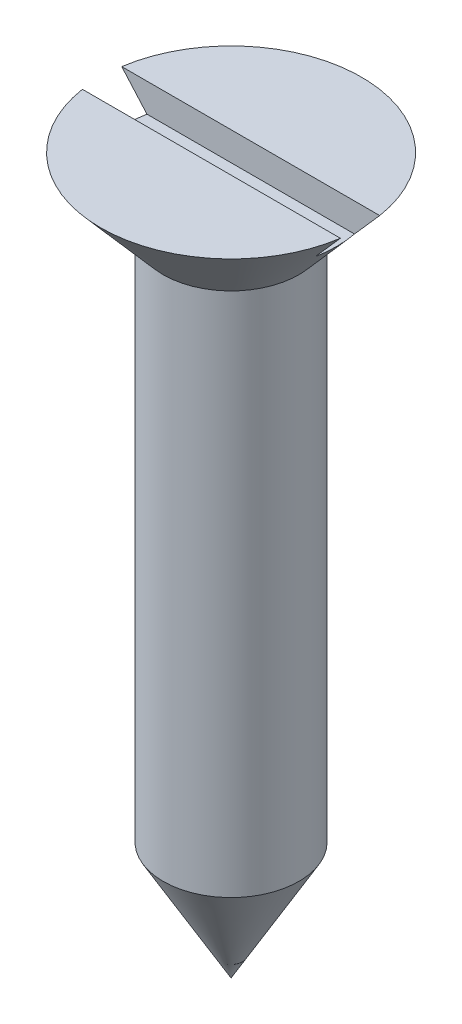
ISO-10303-21;
HEADER;
FILE_DESCRIPTION(('STEP AP214'),'2;1');
FILE_NAME('part.step','',(''),(''),'','','');
FILE_SCHEMA(('AUTOMOTIVE_DESIGN { 1 0 10303 214 1 1 1 1 }'));
ENDSEC;
DATA;
#1=APPLICATION_CONTEXT('core data for automotive mechanical design processes');
#2=APPLICATION_PROTOCOL_DEFINITION('international standard','automotive_design',2000,#1);
#3=PRODUCT_CONTEXT('',#1,'mechanical');
#4=PRODUCT('Part','Part','',(#3));
#5=PRODUCT_RELATED_PRODUCT_CATEGORY('part','',(#4));
#6=PRODUCT_DEFINITION_FORMATION('','',#4);
#7=PRODUCT_DEFINITION_CONTEXT('part definition',#1,'design');
#8=PRODUCT_DEFINITION('design','',#6,#7);
#9=PRODUCT_DEFINITION_SHAPE('','',#8);
#10=(LENGTH_UNIT() NAMED_UNIT(*) SI_UNIT(.MILLI.,.METRE.));
#11=(NAMED_UNIT(*) PLANE_ANGLE_UNIT() SI_UNIT($,.RADIAN.));
#12=(NAMED_UNIT(*) SI_UNIT($,.STERADIAN.) SOLID_ANGLE_UNIT());
#13=UNCERTAINTY_MEASURE_WITH_UNIT(LENGTH_MEASURE(1.E-05),#10,'distance_accuracy_value','');
#14=(GEOMETRIC_REPRESENTATION_CONTEXT(3) GLOBAL_UNCERTAINTY_ASSIGNED_CONTEXT((#13)) GLOBAL_UNIT_ASSIGNED_CONTEXT((#10,
#11,#12)) REPRESENTATION_CONTEXT('',''));
#15=CARTESIAN_POINT('',(0.,0.,0.));
#16=DIRECTION('',(0.,0.,1.));
#17=DIRECTION('',(1.,0.,0.));
#18=AXIS2_PLACEMENT_3D('',#15,#16,#17);
#19=CARTESIAN_POINT('',(0.,25.4,0.));
#20=DIRECTION('',(0.,1.,0.));
#21=DIRECTION('',(0.,0.,1.));
#22=AXIS2_PLACEMENT_3D('',#19,#20,#21);
#23=PLANE('',#22);
#24=DIRECTION('',(1.,0.,0.));
#25=VECTOR('',#24,1.);
#26=CARTESIAN_POINT('',(0.,25.4,0.6985));
#27=LINE('',#26,#25);
#28=CARTESIAN_POINT('',(-4.58257111237786,25.4,0.6985));
#29=VERTEX_POINT('',#28);
#30=CARTESIAN_POINT('',(4.58257111237785,25.4,0.6985));
#31=VERTEX_POINT('',#30);
#32=EDGE_CURVE('E79',#29,#31,#27,.T.);
#33=ORIENTED_EDGE('',*,*,#32,.F.);
#34=CARTESIAN_POINT('',(0.,25.4,0.));
#35=DIRECTION('',(0.,1.,0.));
#36=DIRECTION('',(0.,0.,1.));
#37=AXIS2_PLACEMENT_3D('',#34,#35,#36);
#38=CIRCLE('',#37,4.6355);
#39=EDGE_CURVE('E92',#29,#31,#38,.T.);
#40=ORIENTED_EDGE('',*,*,#39,.T.);
#41=EDGE_LOOP('',(#33,#40));
#42=FACE_BOUND('',#41,.T.);
#43=ADVANCED_FACE('F33',(#42),#23,.T.);
#44=CARTESIAN_POINT('',(0.,25.4,0.));
#45=DIRECTION('',(0.,-1.,0.));
#46=DIRECTION('',(0.,0.,-1.));
#47=AXIS2_PLACEMENT_3D('',#44,#45,#46);
#48=CYLINDRICAL_SURFACE('',#47,2.413);
#49=CARTESIAN_POINT('',(0.,22.8433062149513,0.));
#50=DIRECTION('',(0.,1.,0.));
#51=DIRECTION('',(0.,0.,1.));
#52=AXIS2_PLACEMENT_3D('',#49,#50,#51);
#53=CIRCLE('',#52,2.413);
#54=CARTESIAN_POINT('',(0.,22.8433062149513,2.413));
#55=VERTEX_POINT('',#54);
#56=EDGE_CURVE('E80',#55,#55,#53,.T.);
#57=ORIENTED_EDGE('',*,*,#56,.F.);
#58=EDGE_LOOP('',(#57));
#59=FACE_BOUND('',#58,.T.);
#60=CARTESIAN_POINT('',(0.,4.17943859866376,0.));
#61=DIRECTION('',(0.,1.,0.));
#62=DIRECTION('',(0.,0.,1.));
#63=AXIS2_PLACEMENT_3D('',#60,#61,#62);
#64=CIRCLE('',#63,2.413);
#65=CARTESIAN_POINT('',(0.,4.17943859866376,2.413));
#66=VERTEX_POINT('',#65);
#67=EDGE_CURVE('E97',#66,#66,#64,.T.);
#68=ORIENTED_EDGE('',*,*,#67,.T.);
#69=EDGE_LOOP('',(#68));
#70=FACE_BOUND('',#69,.T.);
#71=ADVANCED_FACE('F35',(#59,#70),#48,.T.);
#72=CARTESIAN_POINT('',(0.,20.0674672483269,0.));
#73=DIRECTION('',(0.,1.,0.));
#74=DIRECTION('',(0.,0.,1.));
#75=AXIS2_PLACEMENT_3D('',#72,#73,#74);
#76=CONICAL_SURFACE('',#75,0.,0.715584993317669);
#77=CARTESIAN_POINT('',(0.,24.384,0.));
#78=DIRECTION('',(0.,1.,0.));
#79=DIRECTION('',(0.,0.,1.));
#80=AXIS2_PLACEMENT_3D('',#77,#78,#79);
#81=CIRCLE('',#80,3.75230467437873);
#82=CARTESIAN_POINT('',(3.68671779763036,24.384,0.6985));
#83=VERTEX_POINT('',#82);
#84=CARTESIAN_POINT('',(3.68671779763036,24.384,-0.6985));
#85=VERTEX_POINT('',#84);
#86=EDGE_CURVE('E11',#83,#85,#81,.T.);
#87=ORIENTED_EDGE('',*,*,#86,.F.);
#88=CARTESIAN_POINT('',(0.66948819119272,21.180484612552,0.6985));
#89=CARTESIAN_POINT('',(0.70780075061148,21.2110288972768,0.6985));
#90=CARTESIAN_POINT('',(0.745482241494177,21.2423388766756,0.6985));
#91=CARTESIAN_POINT('',(0.819825878834664,21.306121869221,0.6985));
#92=CARTESIAN_POINT('',(0.856488407627788,21.3385944353837,0.6985));
#93=CARTESIAN_POINT('',(0.929031823218996,21.4043273560402,0.6985));
#94=CARTESIAN_POINT('',(0.964913407224808,21.4375869474388,0.6985));
#95=CARTESIAN_POINT('',(1.03609562751972,21.50472876414,0.6985));
#96=CARTESIAN_POINT('',(1.07139619963844,21.5386110573543,0.6985));
#97=CARTESIAN_POINT('',(1.17653225641682,21.6408755283551,0.6985));
#98=CARTESIAN_POINT('',(1.24568839991534,21.7099549033106,0.6985));
#99=CARTESIAN_POINT('',(1.3828413492216,21.8492879479461,0.6985));
#100=CARTESIAN_POINT('',(1.45083779610412,21.9195419683176,0.6985));
#101=CARTESIAN_POINT('',(1.62940809397491,22.1061514624158,0.6985));
#102=CARTESIAN_POINT('',(1.73930084792007,22.2231576496802,0.6985));
#103=CARTESIAN_POINT('',(1.95783108143701,22.458336893425,0.6985));
#104=CARTESIAN_POINT('',(2.06646851764258,22.5765099899573,0.6985));
#105=CARTESIAN_POINT('',(2.28292694941331,22.8135876634313,0.6985));
#106=CARTESIAN_POINT('',(2.39074799501332,22.9324921947219,0.6985));
#107=CARTESIAN_POINT('',(2.60584268435994,23.170795665207,0.6985));
#108=CARTESIAN_POINT('',(2.7131163252781,23.2901946069503,0.6985));
#109=CARTESIAN_POINT('',(3.03470273402867,23.6492763147584,0.6985));
#110=CARTESIAN_POINT('',(3.24844307919395,23.8894714508773,0.6985));
#111=CARTESIAN_POINT('',(3.67509044074782,24.370592991005,0.6985));
#112=CARTESIAN_POINT('',(3.8879974688054,24.6115193846896,0.6985));
#113=CARTESIAN_POINT('',(4.37786320501295,25.167038962051,0.6985));
#114=CARTESIAN_POINT('',(4.65464310940397,25.4817897908192,0.6985));
#115=CARTESIAN_POINT('',(5.20770402835151,26.1117322244449,0.6985));
#116=CARTESIAN_POINT('',(5.48398504005479,26.4269238318052,0.6985));
#117=CARTESIAN_POINT('',(6.03557197081792,27.056835438498,0.6985));
#118=CARTESIAN_POINT('',(6.31087864595539,27.3715547758651,0.6985));
#119=CARTESIAN_POINT('',(6.86126898224762,28.0011842263073,0.6985));
#120=CARTESIAN_POINT('',(7.13635264506986,28.3160943379248,0.6985));
#121=CARTESIAN_POINT('',(7.41137370805787,28.6310589730438,0.6985));
#122=B_SPLINE_CURVE_WITH_KNOTS('',3,(#88,#89,#90,#91,#92,#93,#94,#95,#96,#97,#98,#99,#100,#101,
#102,#103,#104,#105,#106,#107,#108,#109,#110,#111,#112,#113,#114,#115,#116,#117,#118,#119,#120,
#121),.UNSPECIFIED.,.F.,.F.,(4,2,2,2,2,2,2,2,2,2,2,2,2,2,2,2,4),(0.,0.146960946431507,
0.293865984560005,0.4406339911682,0.587418100374507,0.880634189071199,1.17393943874732,
1.65548173958468,2.13704062634182,2.61856975651226,3.10010137221846,4.06467338751034,
5.02923184717084,6.28663946570467,7.54405425290256,8.79847758950565,10.0528914584509),.UNSPECIFIED.);
#123=EDGE_CURVE('E89',#83,#31,#122,.T.);
#124=ORIENTED_EDGE('',*,*,#123,.T.);
#125=ORIENTED_EDGE('',*,*,#39,.F.);
#126=CARTESIAN_POINT('',(-7.41137370805787,28.6310589730438,0.6985));
#127=CARTESIAN_POINT('',(-7.13597642228802,28.3156621875907,0.6985));
#128=CARTESIAN_POINT('',(-6.86051542856941,28.000320943673,0.6985));
#129=CARTESIAN_POINT('',(-6.30939583136643,27.369859760637,0.6985));
#130=CARTESIAN_POINT('',(-6.03373724722984,27.0547398046042,0.6985));
#131=CARTESIAN_POINT('',(-5.48217546436862,26.4248576784124,0.6985));
#132=CARTESIAN_POINT('',(-5.20627234720632,26.1100954368686,0.6985));
#133=CARTESIAN_POINT('',(-4.79202597237607,25.6382734414736,0.6985));
#134=CARTESIAN_POINT('',(-4.65387297504744,25.4810466587955,0.6985));
#135=CARTESIAN_POINT('',(-4.37739962864168,25.1667379593284,0.6985));
#136=CARTESIAN_POINT('',(-4.23907927818802,25.0096560437498,0.6985));
#137=CARTESIAN_POINT('',(-3.96214526305182,24.6956033666447,0.6985));
#138=CARTESIAN_POINT('',(-3.82353148200398,24.5386327077065,0.6985));
#139=CARTESIAN_POINT('',(-3.54600682816698,24.2249623832085,0.6985));
#140=CARTESIAN_POINT('',(-3.4070959642996,24.0682627097592,0.6985));
#141=CARTESIAN_POINT('',(-3.12888132107878,23.7552826031554,0.6985));
#142=CARTESIAN_POINT('',(-2.98957764873121,23.5990020749144,0.6985));
#143=CARTESIAN_POINT('',(-2.71032499419123,23.2869877063624,0.6985));
#144=CARTESIAN_POINT('',(-2.57037594512928,23.1312539257864,0.6985));
#145=CARTESIAN_POINT('',(-2.35963795514725,22.8982672075618,0.6985));
#146=CARTESIAN_POINT('',(-2.28922554643418,22.8206738170348,0.6985));
#147=CARTESIAN_POINT('',(-2.14807266795226,22.6657894018884,0.6985));
#148=CARTESIAN_POINT('',(-2.07733220668748,22.5884983695256,0.6985));
#149=CARTESIAN_POINT('',(-1.93543888297653,22.4343433426461,0.6985));
#150=CARTESIAN_POINT('',(-1.86428616697093,22.3574792134623,0.6985));
#151=CARTESIAN_POINT('',(-1.7213792370053,22.2042973299909,0.6985));
#152=CARTESIAN_POINT('',(-1.64962496672675,22.1279796281293,0.6985));
#153=CARTESIAN_POINT('',(-1.50518569314299,21.9760491798227,0.6985));
#154=CARTESIAN_POINT('',(-1.43249964887044,21.9004374215301,0.6985));
#155=CARTESIAN_POINT('',(-1.28590576428496,21.7504371633155,0.6985));
#156=CARTESIAN_POINT('',(-1.21199824851281,21.6760483486155,0.6985));
#157=CARTESIAN_POINT('',(-1.09962421912945,21.5659059687729,0.6985));
#158=CARTESIAN_POINT('',(-1.06188855946922,21.529408261267,0.6985));
#159=CARTESIAN_POINT('',(-0.9857837535798,21.4570876265818,0.6985));
#160=CARTESIAN_POINT('',(-0.947414685092151,21.4212646177319,0.6985));
#161=CARTESIAN_POINT('',(-0.869815934328151,21.3504829299838,0.6985));
#162=CARTESIAN_POINT('',(-0.830585500966873,21.3155250669381,0.6985));
#163=CARTESIAN_POINT('',(-0.75097357219008,21.2469152304926,0.6985));
#164=CARTESIAN_POINT('',(-0.710591595260406,21.2132638176919,0.6985));
#165=CARTESIAN_POINT('',(-0.66948819119272,21.180484612552,0.6985));
#166=B_SPLINE_CURVE_WITH_KNOTS('',3,(#126,#127,#128,#129,#130,#131,#132,#133,#134,#135,#136,
#137,#138,#139,#140,#141,#142,#143,#144,#145,#146,#147,#148,#149,#150,#151,#152,#153,#154,#155,
#156,#157,#158,#159,#160,#161,#162,#163,#164,#165),.UNSPECIFIED.,.F.,.F.,(4,2,2,2,2,2,2,2,2,2,2,
2,2,2,2,2,2,2,2,4),(0.,1.2561327083208,2.51215577118568,3.76785444628878,4.39575451939379,
5.02365979276323,5.65189684280479,6.28011528383589,6.90817654109087,7.53630440539168,
7.85064076679797,8.16496902474983,8.47919174532871,8.79344422000782,9.10808519419374,
9.42264387211635,9.58013219881919,9.73760133779248,9.89521371390526,10.0528929905001),.UNSPECIFIED.);
#167=CARTESIAN_POINT('',(-3.68671779763036,24.384,0.6985));
#168=VERTEX_POINT('',#167);
#169=EDGE_CURVE('E110',#29,#168,#166,.T.);
#170=ORIENTED_EDGE('',*,*,#169,.T.);
#171=CARTESIAN_POINT('',(-3.68671779763036,24.384,-0.6985));
#172=VERTEX_POINT('',#171);
#173=EDGE_CURVE('E37',#172,#168,#81,.T.);
#174=ORIENTED_EDGE('',*,*,#173,.F.);
#175=CARTESIAN_POINT('',(-0.66948819119272,21.180484612552,-0.6985));
#176=CARTESIAN_POINT('',(-0.70780075061148,21.2110288972768,-0.6985));
#177=CARTESIAN_POINT('',(-0.745482241494177,21.2423388766756,-0.6985));
#178=CARTESIAN_POINT('',(-0.819825878834664,21.306121869221,-0.6985));
#179=CARTESIAN_POINT('',(-0.856488407627788,21.3385944353837,-0.6985));
#180=CARTESIAN_POINT('',(-0.929031823218996,21.4043273560402,-0.6985));
#181=CARTESIAN_POINT('',(-0.964913407224808,21.4375869474388,-0.6985));
#182=CARTESIAN_POINT('',(-1.03609562751972,21.50472876414,-0.6985));
#183=CARTESIAN_POINT('',(-1.07139619963844,21.5386110573543,-0.6985));
#184=CARTESIAN_POINT('',(-1.17653225641682,21.6408755283551,-0.6985));
#185=CARTESIAN_POINT('',(-1.24568839991534,21.7099549033106,-0.6985));
#186=CARTESIAN_POINT('',(-1.3828413492216,21.8492879479461,-0.6985));
#187=CARTESIAN_POINT('',(-1.45083779610412,21.9195419683176,-0.6985));
#188=CARTESIAN_POINT('',(-1.62940809397491,22.1061514624158,-0.6985));
#189=CARTESIAN_POINT('',(-1.73930084792007,22.2231576496802,-0.6985));
#190=CARTESIAN_POINT('',(-1.95783108143701,22.458336893425,-0.6985));
#191=CARTESIAN_POINT('',(-2.06646851764258,22.5765099899573,-0.6985));
#192=CARTESIAN_POINT('',(-2.28292694941331,22.8135876634313,-0.6985));
#193=CARTESIAN_POINT('',(-2.39074799501332,22.9324921947219,-0.6985));
#194=CARTESIAN_POINT('',(-2.60584268435994,23.170795665207,-0.6985));
#195=CARTESIAN_POINT('',(-2.7131163252781,23.2901946069503,-0.6985));
#196=CARTESIAN_POINT('',(-3.03470273402867,23.6492763147584,-0.6985));
#197=CARTESIAN_POINT('',(-3.24844307919395,23.8894714508773,-0.6985));
#198=CARTESIAN_POINT('',(-3.67509044074782,24.370592991005,-0.6985));
#199=CARTESIAN_POINT('',(-3.8879974688054,24.6115193846896,-0.6985));
#200=CARTESIAN_POINT('',(-4.37786320501295,25.167038962051,-0.6985));
#201=CARTESIAN_POINT('',(-4.65464310940397,25.4817897908192,-0.6985));
#202=CARTESIAN_POINT('',(-5.20770402835151,26.1117322244449,-0.6985));
#203=CARTESIAN_POINT('',(-5.48398504005479,26.4269238318052,-0.6985));
#204=CARTESIAN_POINT('',(-6.03557197081792,27.056835438498,-0.6985));
#205=CARTESIAN_POINT('',(-6.31087864595539,27.3715547758651,-0.6985));
#206=CARTESIAN_POINT('',(-6.86126898224762,28.0011842263073,-0.6985));
#207=CARTESIAN_POINT('',(-7.13635264506986,28.3160943379248,-0.6985));
#208=CARTESIAN_POINT('',(-7.41137370805787,28.6310589730438,-0.6985));
#209=B_SPLINE_CURVE_WITH_KNOTS('',3,(#175,#176,#177,#178,#179,#180,#181,#182,#183,#184,#185,
#186,#187,#188,#189,#190,#191,#192,#193,#194,#195,#196,#197,#198,#199,#200,#201,#202,#203,#204,
#205,#206,#207,#208),.UNSPECIFIED.,.F.,.F.,(4,2,2,2,2,2,2,2,2,2,2,2,2,2,2,2,4),(0.,
0.146960946431507,0.293865984560005,0.4406339911682,0.587418100374507,0.880634189071199,
1.17393943874732,1.65548173958468,2.13704062634182,2.61856975651226,3.10010137221846,
4.06467338751034,5.02923184717084,6.28663946570467,7.54405425290256,8.79847758950565,
10.0528914584509),.UNSPECIFIED.);
#210=CARTESIAN_POINT('',(-4.58257111237786,25.4,-0.6985));
#211=VERTEX_POINT('',#210);
#212=EDGE_CURVE('E74',#172,#211,#209,.T.);
#213=ORIENTED_EDGE('',*,*,#212,.T.);
#214=CARTESIAN_POINT('',(4.58257111237786,25.4,-0.6985));
#215=VERTEX_POINT('',#214);
#216=EDGE_CURVE('E87',#215,#211,#38,.T.);
#217=ORIENTED_EDGE('',*,*,#216,.F.);
#218=CARTESIAN_POINT('',(7.41137370805787,28.6310589730438,-0.6985));
#219=CARTESIAN_POINT('',(7.13597642228802,28.3156621875907,-0.6985));
#220=CARTESIAN_POINT('',(6.86051542856941,28.000320943673,-0.6985));
#221=CARTESIAN_POINT('',(6.30939583136643,27.369859760637,-0.6985));
#222=CARTESIAN_POINT('',(6.03373724722984,27.0547398046042,-0.6985));
#223=CARTESIAN_POINT('',(5.48217546436862,26.4248576784124,-0.6985));
#224=CARTESIAN_POINT('',(5.20627234720632,26.1100954368686,-0.6985));
#225=CARTESIAN_POINT('',(4.79202597237607,25.6382734414736,-0.6985));
#226=CARTESIAN_POINT('',(4.65387297504744,25.4810466587955,-0.6985));
#227=CARTESIAN_POINT('',(4.37739962864168,25.1667379593284,-0.6985));
#228=CARTESIAN_POINT('',(4.23907927818802,25.0096560437498,-0.6985));
#229=CARTESIAN_POINT('',(3.96214526305182,24.6956033666447,-0.6985));
#230=CARTESIAN_POINT('',(3.82353148200398,24.5386327077065,-0.6985));
#231=CARTESIAN_POINT('',(3.54600682816698,24.2249623832085,-0.6985));
#232=CARTESIAN_POINT('',(3.4070959642996,24.0682627097592,-0.6985));
#233=CARTESIAN_POINT('',(3.12888132107878,23.7552826031554,-0.6985));
#234=CARTESIAN_POINT('',(2.98957764873121,23.5990020749144,-0.6985));
#235=CARTESIAN_POINT('',(2.71032499419123,23.2869877063624,-0.6985));
#236=CARTESIAN_POINT('',(2.57037594512928,23.1312539257864,-0.6985));
#237=CARTESIAN_POINT('',(2.35963795514725,22.8982672075618,-0.6985));
#238=CARTESIAN_POINT('',(2.28922554643418,22.8206738170348,-0.6985));
#239=CARTESIAN_POINT('',(2.14807266795226,22.6657894018884,-0.6985));
#240=CARTESIAN_POINT('',(2.07733220668748,22.5884983695256,-0.6985));
#241=CARTESIAN_POINT('',(1.93543888297653,22.4343433426461,-0.6985));
#242=CARTESIAN_POINT('',(1.86428616697093,22.3574792134623,-0.6985));
#243=CARTESIAN_POINT('',(1.7213792370053,22.2042973299909,-0.6985));
#244=CARTESIAN_POINT('',(1.64962496672675,22.1279796281293,-0.6985));
#245=CARTESIAN_POINT('',(1.50518569314299,21.9760491798227,-0.6985));
#246=CARTESIAN_POINT('',(1.43249964887044,21.9004374215301,-0.6985));
#247=CARTESIAN_POINT('',(1.28590576428496,21.7504371633155,-0.6985));
#248=CARTESIAN_POINT('',(1.21199824851281,21.6760483486155,-0.6985));
#249=CARTESIAN_POINT('',(1.09962421912945,21.5659059687729,-0.6985));
#250=CARTESIAN_POINT('',(1.06188855946922,21.529408261267,-0.6985));
#251=CARTESIAN_POINT('',(0.9857837535798,21.4570876265818,-0.6985));
#252=CARTESIAN_POINT('',(0.947414685092151,21.4212646177319,-0.6985));
#253=CARTESIAN_POINT('',(0.869815934328151,21.3504829299838,-0.6985));
#254=CARTESIAN_POINT('',(0.830585500966873,21.3155250669381,-0.6985));
#255=CARTESIAN_POINT('',(0.75097357219008,21.2469152304926,-0.6985));
#256=CARTESIAN_POINT('',(0.710591595260406,21.2132638176919,-0.6985));
#257=CARTESIAN_POINT('',(0.66948819119272,21.180484612552,-0.6985));
#258=B_SPLINE_CURVE_WITH_KNOTS('',3,(#218,#219,#220,#221,#222,#223,#224,#225,#226,#227,#228,
#229,#230,#231,#232,#233,#234,#235,#236,#237,#238,#239,#240,#241,#242,#243,#244,#245,#246,#247,
#248,#249,#250,#251,#252,#253,#254,#255,#256,#257),.UNSPECIFIED.,.F.,.F.,(4,2,2,2,2,2,2,2,2,2,2,
2,2,2,2,2,2,2,2,4),(0.,1.2561327083208,2.51215577118568,3.76785444628878,4.39575451939379,
5.02365979276323,5.65189684280479,6.28011528383589,6.90817654109087,7.53630440539168,
7.85064076679797,8.16496902474983,8.47919174532871,8.79344422000782,9.10808519419374,
9.42264387211635,9.58013219881919,9.73760133779248,9.89521371390526,10.0528929905001),.UNSPECIFIED.);
#259=EDGE_CURVE('E48',#215,#85,#258,.T.);
#260=ORIENTED_EDGE('',*,*,#259,.T.);
#261=EDGE_LOOP('',(#87,#124,#125,#170,#174,#213,#217,#260));
#262=FACE_BOUND('',#261,.T.);
#263=ORIENTED_EDGE('',*,*,#56,.T.);
#264=EDGE_LOOP('',(#263));
#265=FACE_BOUND('',#264,.T.);
#266=ADVANCED_FACE('F85',(#262,#265),#76,.T.);
#267=DIRECTION('',(-1.,0.,0.));
#268=VECTOR('',#267,1.);
#269=CARTESIAN_POINT('',(0.,25.4,-0.6985));
#270=LINE('',#269,#268);
#271=EDGE_CURVE('E71',#215,#211,#270,.T.);
#272=ORIENTED_EDGE('',*,*,#271,.F.);
#273=ORIENTED_EDGE('',*,*,#216,.T.);
#274=EDGE_LOOP('',(#272,#273));
#275=FACE_BOUND('',#274,.T.);
#276=ADVANCED_FACE('F91',(#275),#23,.T.);
#277=CARTESIAN_POINT('',(0.,4.17943859866376,0.));
#278=DIRECTION('',(0.,1.,0.));
#279=DIRECTION('',(0.,0.,1.));
#280=AXIS2_PLACEMENT_3D('',#277,#278,#279);
#281=CONICAL_SURFACE('',#280,2.413,0.523598775598293);
#282=CARTESIAN_POINT('',(0.,0.,0.));
#283=VERTEX_POINT('',#282);
#284=VERTEX_LOOP('',#283);
#285=FACE_BOUND('',#284,.T.);
#286=ORIENTED_EDGE('',*,*,#67,.F.);
#287=EDGE_LOOP('',(#286));
#288=FACE_BOUND('',#287,.T.);
#289=ADVANCED_FACE('F132',(#285,#288),#281,.T.);
#290=CARTESIAN_POINT('',(0.,24.384,0.));
#291=DIRECTION('',(0.,1.,0.));
#292=DIRECTION('',(0.,0.,1.));
#293=AXIS2_PLACEMENT_3D('',#290,#291,#292);
#294=PLANE('',#293);
#295=ORIENTED_EDGE('',*,*,#86,.T.);
#296=DIRECTION('',(-1.,0.,0.));
#297=VECTOR('',#296,1.);
#298=CARTESIAN_POINT('',(-5.9055,24.384,-0.6985));
#299=LINE('',#298,#297);
#300=EDGE_CURVE('E108',#85,#172,#299,.T.);
#301=ORIENTED_EDGE('',*,*,#300,.T.);
#302=ORIENTED_EDGE('',*,*,#173,.T.);
#303=DIRECTION('',(1.,0.,0.));
#304=VECTOR('',#303,1.);
#305=CARTESIAN_POINT('',(-5.9055,24.384,0.6985));
#306=LINE('',#305,#304);
#307=EDGE_CURVE('E107',#168,#83,#306,.T.);
#308=ORIENTED_EDGE('',*,*,#307,.T.);
#309=EDGE_LOOP('',(#295,#301,#302,#308));
#310=FACE_BOUND('',#309,.T.);
#311=ADVANCED_FACE('F106',(#310),#294,.T.);
#312=CARTESIAN_POINT('',(-5.9055,24.384,0.6985));
#313=DIRECTION('',(0.,0.,1.));
#314=DIRECTION('',(1.,0.,0.));
#315=AXIS2_PLACEMENT_3D('',#312,#313,#314);
#316=PLANE('',#315);
#317=ORIENTED_EDGE('',*,*,#32,.T.);
#318=ORIENTED_EDGE('',*,*,#123,.F.);
#319=ORIENTED_EDGE('',*,*,#307,.F.);
#320=ORIENTED_EDGE('',*,*,#169,.F.);
#321=EDGE_LOOP('',(#317,#318,#319,#320));
#322=FACE_BOUND('',#321,.T.);
#323=ADVANCED_FACE('F109',(#322),#316,.F.);
#324=CARTESIAN_POINT('',(-5.9055,24.384,-0.6985));
#325=DIRECTION('',(0.,0.,-1.));
#326=DIRECTION('',(-1.,0.,0.));
#327=AXIS2_PLACEMENT_3D('',#324,#325,#326);
#328=PLANE('',#327);
#329=ORIENTED_EDGE('',*,*,#300,.F.);
#330=ORIENTED_EDGE('',*,*,#259,.F.);
#331=ORIENTED_EDGE('',*,*,#271,.T.);
#332=ORIENTED_EDGE('',*,*,#212,.F.);
#333=EDGE_LOOP('',(#329,#330,#331,#332));
#334=FACE_BOUND('',#333,.T.);
#335=ADVANCED_FACE('F73',(#334),#328,.F.);
#336=CLOSED_SHELL('',(#43,#71,#266,#276,#289,#311,#323,#335));
#337=MANIFOLD_SOLID_BREP('B2',#336);
#338=ADVANCED_BREP_SHAPE_REPRESENTATION('',(#18,#337),#14);
#339=SHAPE_DEFINITION_REPRESENTATION(#9,#338);
ENDSEC;
END-ISO-10303-21;
